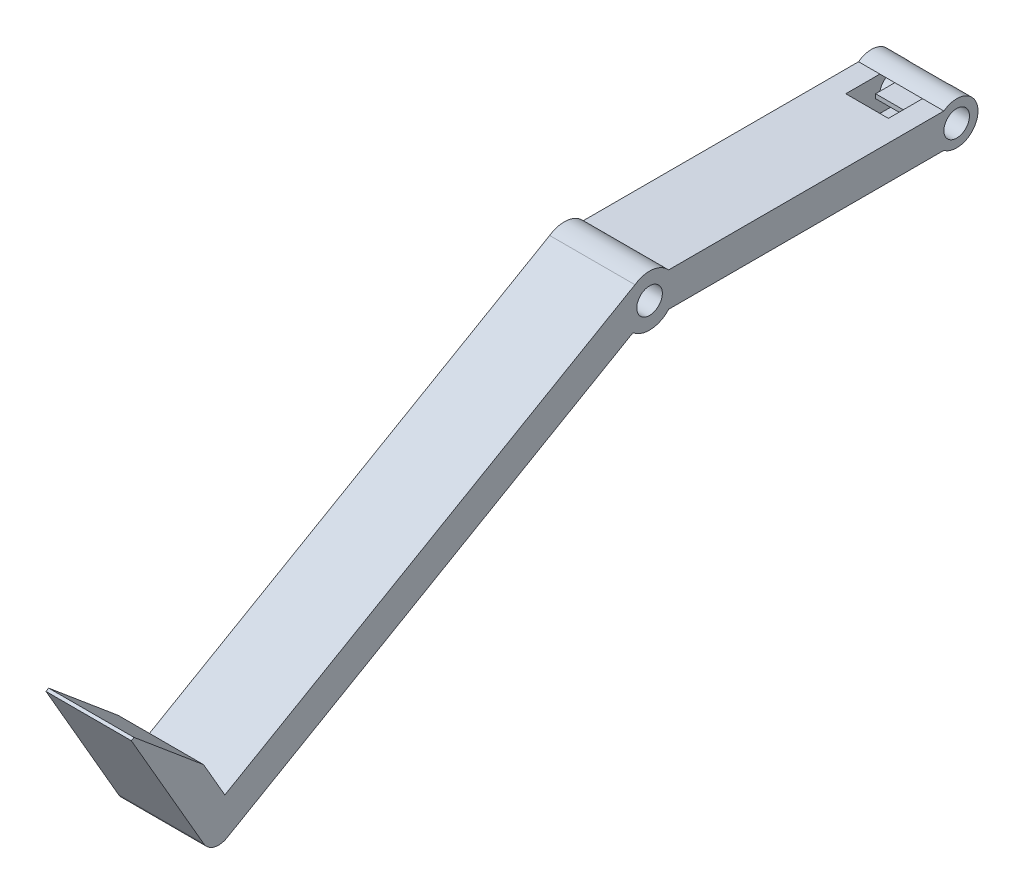
ISO-10303-21;
HEADER;
FILE_DESCRIPTION(('STEP AP214'),'2;1');
FILE_NAME('part.step','',(''),(''),'','','');
FILE_SCHEMA(('AUTOMOTIVE_DESIGN { 1 0 10303 214 1 1 1 1 }'));
ENDSEC;
DATA;
#1=APPLICATION_CONTEXT('core data for automotive mechanical design processes');
#2=APPLICATION_PROTOCOL_DEFINITION('international standard','automotive_design',2000,#1);
#3=PRODUCT_CONTEXT('',#1,'mechanical');
#4=PRODUCT('Part','Part','',(#3));
#5=PRODUCT_RELATED_PRODUCT_CATEGORY('part','',(#4));
#6=PRODUCT_DEFINITION_FORMATION('','',#4);
#7=PRODUCT_DEFINITION_CONTEXT('part definition',#1,'design');
#8=PRODUCT_DEFINITION('design','',#6,#7);
#9=PRODUCT_DEFINITION_SHAPE('','',#8);
#10=(LENGTH_UNIT() NAMED_UNIT(*) SI_UNIT(.MILLI.,.METRE.));
#11=(NAMED_UNIT(*) PLANE_ANGLE_UNIT() SI_UNIT($,.RADIAN.));
#12=(NAMED_UNIT(*) SI_UNIT($,.STERADIAN.) SOLID_ANGLE_UNIT());
#13=UNCERTAINTY_MEASURE_WITH_UNIT(LENGTH_MEASURE(1.E-05),#10,'distance_accuracy_value','');
#14=(GEOMETRIC_REPRESENTATION_CONTEXT(3) GLOBAL_UNCERTAINTY_ASSIGNED_CONTEXT((#13)) GLOBAL_UNIT_ASSIGNED_CONTEXT((#10,
#11,#12)) REPRESENTATION_CONTEXT('',''));
#15=CARTESIAN_POINT('',(0.,0.,0.));
#16=DIRECTION('',(0.,0.,1.));
#17=DIRECTION('',(1.,0.,0.));
#18=AXIS2_PLACEMENT_3D('',#15,#16,#17);
#19=CARTESIAN_POINT('',(-5.,4.71181738099879,19.2829834340757));
#20=DIRECTION('',(0.,0.866025403784442,0.499999999999995));
#21=DIRECTION('',(0.,-0.499999999999995,0.866025403784442));
#22=AXIS2_PLACEMENT_3D('',#19,#20,#21);
#23=PLANE('',#22);
#24=DIRECTION('',(0.,-0.499999999999995,0.866025403784442));
#25=VECTOR('',#24,1.);
#26=CARTESIAN_POINT('',(-5.,4.71181738099879,19.2829834340757));
#27=LINE('',#26,#25);
#28=CARTESIAN_POINT('',(-5.,4.4670049370436,19.7070110253312));
#29=VERTEX_POINT('',#28);
#30=CARTESIAN_POINT('',(-4.99999999999999,-23.2881826190009,67.7804060460045));
#31=VERTEX_POINT('',#30);
#32=EDGE_CURVE('E226',#29,#31,#27,.T.);
#33=ORIENTED_EDGE('',*,*,#32,.T.);
#34=DIRECTION('',(-1.,0.,0.));
#35=VECTOR('',#34,1.);
#36=CARTESIAN_POINT('',(5.00000000000001,-23.2881826190009,67.7804060460045));
#37=LINE('',#36,#35);
#38=CARTESIAN_POINT('',(5.00000000000001,-23.2881826190009,67.7804060460045));
#39=VERTEX_POINT('',#38);
#40=EDGE_CURVE('E237',#39,#31,#37,.T.);
#41=ORIENTED_EDGE('',*,*,#40,.F.);
#42=DIRECTION('',(0.,-0.499999999999995,0.866025403784442));
#43=VECTOR('',#42,1.);
#44=CARTESIAN_POINT('',(5.,4.71181738099879,19.2829834340757));
#45=LINE('',#44,#43);
#46=CARTESIAN_POINT('',(5.,4.4670049370436,19.7070110253312));
#47=VERTEX_POINT('',#46);
#48=EDGE_CURVE('E245',#47,#39,#45,.T.);
#49=ORIENTED_EDGE('',*,*,#48,.F.);
#50=DIRECTION('',(1.,0.,0.));
#51=VECTOR('',#50,1.);
#52=CARTESIAN_POINT('',(-5.,4.46700493704361,19.7070110253312));
#53=LINE('',#52,#51);
#54=EDGE_CURVE('E386',#47,#29,#53,.F.);
#55=ORIENTED_EDGE('',*,*,#54,.T.);
#56=EDGE_LOOP('',(#33,#41,#49,#55));
#57=FACE_BOUND('',#56,.T.);
#58=ADVANCED_FACE('F33',(#57),#23,.T.);
#59=CARTESIAN_POINT('',(-5.,2.,18.));
#60=DIRECTION('',(1.,0.,0.));
#61=DIRECTION('',(0.,0.,-1.));
#62=AXIS2_PLACEMENT_3D('',#59,#60,#61);
#63=CYLINDRICAL_SURFACE('',#62,2.99999999999999);
#64=DIRECTION('',(1.,0.,0.));
#65=VECTOR('',#64,1.);
#66=CARTESIAN_POINT('',(-5.,-0.287125304876964,19.9414061501374));
#67=LINE('',#66,#65);
#68=CARTESIAN_POINT('',(-5.,-0.287125304876964,19.9414061501374));
#69=VERTEX_POINT('',#68);
#70=CARTESIAN_POINT('',(5.,-0.287125304876965,19.9414061501374));
#71=VERTEX_POINT('',#70);
#72=EDGE_CURVE('E391',#69,#71,#67,.T.);
#73=ORIENTED_EDGE('',*,*,#72,.F.);
#74=CARTESIAN_POINT('',(-5.,2.,18.));
#75=DIRECTION('',(1.,0.,0.));
#76=DIRECTION('',(0.,0.,-1.));
#77=AXIS2_PLACEMENT_3D('',#74,#75,#76);
#78=CIRCLE('',#77,2.99999999999999);
#79=CARTESIAN_POINT('',(-5.,0.,15.7639320225002));
#80=VERTEX_POINT('',#79);
#81=EDGE_CURVE('E347',#69,#80,#78,.T.);
#82=ORIENTED_EDGE('',*,*,#81,.T.);
#83=DIRECTION('',(1.,0.,0.));
#84=VECTOR('',#83,1.);
#85=CARTESIAN_POINT('',(-5.,0.,15.7639320225002));
#86=LINE('',#85,#84);
#87=CARTESIAN_POINT('',(5.,0.,15.7639320225002));
#88=VERTEX_POINT('',#87);
#89=EDGE_CURVE('E359',#88,#80,#86,.F.);
#90=ORIENTED_EDGE('',*,*,#89,.F.);
#91=CARTESIAN_POINT('',(5.,2.,18.));
#92=DIRECTION('',(1.,0.,0.));
#93=DIRECTION('',(0.,0.,-1.));
#94=AXIS2_PLACEMENT_3D('',#91,#92,#93);
#95=CIRCLE('',#94,2.99999999999999);
#96=EDGE_CURVE('E342',#71,#88,#95,.T.);
#97=ORIENTED_EDGE('',*,*,#96,.F.);
#98=EDGE_LOOP('',(#73,#82,#90,#97));
#99=FACE_BOUND('',#98,.T.);
#100=ADVANCED_FACE('F420',(#99),#63,.T.);
#101=CARTESIAN_POINT('',(2.5,0.,-12.5));
#102=DIRECTION('',(1.,0.,0.));
#103=DIRECTION('',(0.,0.,-1.));
#104=AXIS2_PLACEMENT_3D('',#101,#102,#103);
#105=PLANE('',#104);
#106=CARTESIAN_POINT('',(2.5,2.,-18.));
#107=DIRECTION('',(1.,0.,0.));
#108=DIRECTION('',(0.,0.,-1.));
#109=AXIS2_PLACEMENT_3D('',#106,#107,#108);
#110=CIRCLE('',#109,2.5);
#111=CARTESIAN_POINT('',(2.5,4.,-19.5));
#112=VERTEX_POINT('',#111);
#113=CARTESIAN_POINT('',(2.5,0.,-19.5));
#114=VERTEX_POINT('',#113);
#115=EDGE_CURVE('E324',#112,#114,#110,.F.);
#116=ORIENTED_EDGE('',*,*,#115,.T.);
#117=DIRECTION('',(0.,0.,-1.));
#118=VECTOR('',#117,1.);
#119=CARTESIAN_POINT('',(2.5,0.,-12.5));
#120=LINE('',#119,#118);
#121=CARTESIAN_POINT('',(2.5,0.,-16.5));
#122=VERTEX_POINT('',#121);
#123=EDGE_CURVE('E299',#122,#114,#120,.T.);
#124=ORIENTED_EDGE('',*,*,#123,.F.);
#125=CARTESIAN_POINT('',(2.5,0.,-12.5));
#126=VERTEX_POINT('',#125);
#127=EDGE_CURVE('E295',#126,#122,#120,.T.);
#128=ORIENTED_EDGE('',*,*,#127,.F.);
#129=DIRECTION('',(0.,1.,0.));
#130=VECTOR('',#129,1.);
#131=CARTESIAN_POINT('',(2.5,0.,-12.5));
#132=LINE('',#131,#130);
#133=CARTESIAN_POINT('',(2.5,4.,-12.5));
#134=VERTEX_POINT('',#133);
#135=EDGE_CURVE('E315',#126,#134,#132,.T.);
#136=ORIENTED_EDGE('',*,*,#135,.T.);
#137=DIRECTION('',(0.,0.,-1.));
#138=VECTOR('',#137,1.);
#139=CARTESIAN_POINT('',(2.5,4.,-12.5));
#140=LINE('',#139,#138);
#141=CARTESIAN_POINT('',(2.5,4.,-16.5));
#142=VERTEX_POINT('',#141);
#143=EDGE_CURVE('E307',#134,#142,#140,.T.);
#144=ORIENTED_EDGE('',*,*,#143,.T.);
#145=EDGE_CURVE('E294',#142,#112,#140,.T.);
#146=ORIENTED_EDGE('',*,*,#145,.T.);
#147=EDGE_LOOP('',(#116,#124,#128,#136,#144,#146));
#148=FACE_BOUND('',#147,.T.);
#149=DIRECTION('',(0.,0.,1.));
#150=VECTOR('',#149,1.);
#151=CARTESIAN_POINT('',(2.5,1.75,-16.));
#152=LINE('',#151,#150);
#153=CARTESIAN_POINT('',(2.5,1.75,-16.5209800542251));
#154=VERTEX_POINT('',#153);
#155=CARTESIAN_POINT('',(2.5,1.75,-16.));
#156=VERTEX_POINT('',#155);
#157=EDGE_CURVE('E271',#154,#156,#152,.T.);
#158=ORIENTED_EDGE('',*,*,#157,.F.);
#159=CARTESIAN_POINT('',(2.5,2.,-18.));
#160=DIRECTION('',(1.,0.,0.));
#161=DIRECTION('',(0.,0.,-1.));
#162=AXIS2_PLACEMENT_3D('',#159,#160,#161);
#163=CIRCLE('',#162,1.5);
#164=CARTESIAN_POINT('',(2.5,1.75,-19.4790199457749));
#165=VERTEX_POINT('',#164);
#166=EDGE_CURVE('E327',#165,#154,#163,.F.);
#167=ORIENTED_EDGE('',*,*,#166,.F.);
#168=CARTESIAN_POINT('',(2.5,1.75,-20.));
#169=VERTEX_POINT('',#168);
#170=EDGE_CURVE('E272',#169,#165,#152,.T.);
#171=ORIENTED_EDGE('',*,*,#170,.F.);
#172=DIRECTION('',(0.,-1.,0.));
#173=VECTOR('',#172,1.);
#174=CARTESIAN_POINT('',(2.5,2.25,-20.));
#175=LINE('',#174,#173);
#176=CARTESIAN_POINT('',(2.5,2.25,-20.));
#177=VERTEX_POINT('',#176);
#178=EDGE_CURVE('E252',#177,#169,#175,.T.);
#179=ORIENTED_EDGE('',*,*,#178,.F.);
#180=DIRECTION('',(0.,0.,-1.));
#181=VECTOR('',#180,1.);
#182=CARTESIAN_POINT('',(2.5,2.25,-16.));
#183=LINE('',#182,#181);
#184=CARTESIAN_POINT('',(2.5,2.25,-19.4790199457749));
#185=VERTEX_POINT('',#184);
#186=EDGE_CURVE('E279',#185,#177,#183,.T.);
#187=ORIENTED_EDGE('',*,*,#186,.F.);
#188=CARTESIAN_POINT('',(2.5,2.25,-16.5209800542251));
#189=VERTEX_POINT('',#188);
#190=EDGE_CURVE('E775',#189,#185,#163,.F.);
#191=ORIENTED_EDGE('',*,*,#190,.F.);
#192=CARTESIAN_POINT('',(2.5,2.25,-16.));
#193=VERTEX_POINT('',#192);
#194=EDGE_CURVE('E260',#193,#189,#183,.T.);
#195=ORIENTED_EDGE('',*,*,#194,.F.);
#196=DIRECTION('',(0.,1.,0.));
#197=VECTOR('',#196,1.);
#198=CARTESIAN_POINT('',(2.5,2.25,-16.));
#199=LINE('',#198,#197);
#200=EDGE_CURVE('E275',#156,#193,#199,.T.);
#201=ORIENTED_EDGE('',*,*,#200,.F.);
#202=EDGE_LOOP('',(#158,#167,#171,#179,#187,#191,#195,#201));
#203=FACE_BOUND('',#202,.T.);
#204=ADVANCED_FACE('F426',(#148,#203),#105,.F.);
#205=CARTESIAN_POINT('',(-2.5,0.,-12.5));
#206=DIRECTION('',(-1.,0.,0.));
#207=DIRECTION('',(0.,0.,1.));
#208=AXIS2_PLACEMENT_3D('',#205,#206,#207);
#209=PLANE('',#208);
#210=CARTESIAN_POINT('',(-2.5,2.,-18.));
#211=DIRECTION('',(-1.,0.,0.));
#212=DIRECTION('',(0.,0.,1.));
#213=AXIS2_PLACEMENT_3D('',#210,#211,#212);
#214=CIRCLE('',#213,2.5);
#215=CARTESIAN_POINT('',(-2.5,0.,-19.5));
#216=VERTEX_POINT('',#215);
#217=CARTESIAN_POINT('',(-2.5,4.,-19.5));
#218=VERTEX_POINT('',#217);
#219=EDGE_CURVE('E320',#216,#218,#214,.F.);
#220=ORIENTED_EDGE('',*,*,#219,.T.);
#221=DIRECTION('',(0.,0.,1.));
#222=VECTOR('',#221,1.);
#223=CARTESIAN_POINT('',(-2.5,4.,-12.5));
#224=LINE('',#223,#222);
#225=CARTESIAN_POINT('',(-2.5,4.,-16.5));
#226=VERTEX_POINT('',#225);
#227=EDGE_CURVE('E311',#218,#226,#224,.T.);
#228=ORIENTED_EDGE('',*,*,#227,.T.);
#229=CARTESIAN_POINT('',(-2.5,4.,-12.5));
#230=VERTEX_POINT('',#229);
#231=EDGE_CURVE('E309',#226,#230,#224,.T.);
#232=ORIENTED_EDGE('',*,*,#231,.T.);
#233=DIRECTION('',(0.,1.,0.));
#234=VECTOR('',#233,1.);
#235=CARTESIAN_POINT('',(-2.5,0.,-12.5));
#236=LINE('',#235,#234);
#237=CARTESIAN_POINT('',(-2.5,0.,-12.5));
#238=VERTEX_POINT('',#237);
#239=EDGE_CURVE('E306',#238,#230,#236,.T.);
#240=ORIENTED_EDGE('',*,*,#239,.F.);
#241=DIRECTION('',(0.,0.,1.));
#242=VECTOR('',#241,1.);
#243=CARTESIAN_POINT('',(-2.5,0.,-12.5));
#244=LINE('',#243,#242);
#245=CARTESIAN_POINT('',(-2.5,0.,-16.5));
#246=VERTEX_POINT('',#245);
#247=EDGE_CURVE('E298',#246,#238,#244,.T.);
#248=ORIENTED_EDGE('',*,*,#247,.F.);
#249=EDGE_CURVE('E302',#216,#246,#244,.T.);
#250=ORIENTED_EDGE('',*,*,#249,.F.);
#251=EDGE_LOOP('',(#220,#228,#232,#240,#248,#250));
#252=FACE_BOUND('',#251,.T.);
#253=DIRECTION('',(0.,0.,1.));
#254=VECTOR('',#253,1.);
#255=CARTESIAN_POINT('',(-2.5,1.75,-16.));
#256=LINE('',#255,#254);
#257=CARTESIAN_POINT('',(-2.5,1.75,-20.));
#258=VERTEX_POINT('',#257);
#259=CARTESIAN_POINT('',(-2.5,1.75,-19.4790199457749));
#260=VERTEX_POINT('',#259);
#261=EDGE_CURVE('E261',#258,#260,#256,.T.);
#262=ORIENTED_EDGE('',*,*,#261,.T.);
#263=CARTESIAN_POINT('',(-2.5,2.,-18.));
#264=DIRECTION('',(-1.,0.,0.));
#265=DIRECTION('',(0.,0.,1.));
#266=AXIS2_PLACEMENT_3D('',#263,#264,#265);
#267=CIRCLE('',#266,1.5);
#268=CARTESIAN_POINT('',(-2.5,1.75,-16.5209800542251));
#269=VERTEX_POINT('',#268);
#270=EDGE_CURVE('E323',#269,#260,#267,.F.);
#271=ORIENTED_EDGE('',*,*,#270,.F.);
#272=DIRECTION('',(0.,0.,-1.));
#273=VECTOR('',#272,1.);
#274=CARTESIAN_POINT('',(-2.5,1.75,-12.5));
#275=LINE('',#274,#273);
#276=CARTESIAN_POINT('',(-2.5,1.75,-16.));
#277=VERTEX_POINT('',#276);
#278=EDGE_CURVE('E382',#277,#269,#275,.T.);
#279=ORIENTED_EDGE('',*,*,#278,.F.);
#280=DIRECTION('',(0.,1.,0.));
#281=VECTOR('',#280,1.);
#282=CARTESIAN_POINT('',(-2.5,2.25,-16.));
#283=LINE('',#282,#281);
#284=CARTESIAN_POINT('',(-2.5,2.25,-16.));
#285=VERTEX_POINT('',#284);
#286=EDGE_CURVE('E263',#277,#285,#283,.T.);
#287=ORIENTED_EDGE('',*,*,#286,.T.);
#288=DIRECTION('',(0.,0.,-1.));
#289=VECTOR('',#288,1.);
#290=CARTESIAN_POINT('',(-2.5,2.25,-16.));
#291=LINE('',#290,#289);
#292=CARTESIAN_POINT('',(-2.5,2.25,-16.5209800542251));
#293=VERTEX_POINT('',#292);
#294=EDGE_CURVE('E266',#285,#293,#291,.T.);
#295=ORIENTED_EDGE('',*,*,#294,.T.);
#296=CARTESIAN_POINT('',(-2.5,2.25,-19.4790199457749));
#297=VERTEX_POINT('',#296);
#298=EDGE_CURVE('E758',#297,#293,#267,.F.);
#299=ORIENTED_EDGE('',*,*,#298,.F.);
#300=DIRECTION('',(0.,0.,1.));
#301=VECTOR('',#300,1.);
#302=CARTESIAN_POINT('',(-2.5,2.25,-12.5));
#303=LINE('',#302,#301);
#304=CARTESIAN_POINT('',(-2.5,2.25,-20.));
#305=VERTEX_POINT('',#304);
#306=EDGE_CURVE('E383',#305,#297,#303,.T.);
#307=ORIENTED_EDGE('',*,*,#306,.F.);
#308=DIRECTION('',(0.,-1.,0.));
#309=VECTOR('',#308,1.);
#310=CARTESIAN_POINT('',(-2.5,2.25,-20.));
#311=LINE('',#310,#309);
#312=EDGE_CURVE('E257',#305,#258,#311,.T.);
#313=ORIENTED_EDGE('',*,*,#312,.T.);
#314=EDGE_LOOP('',(#262,#271,#279,#287,#295,#299,#307,#313));
#315=FACE_BOUND('',#314,.T.);
#316=ADVANCED_FACE('F470',(#252,#315),#209,.F.);
#317=CARTESIAN_POINT('',(-5.,2.,-18.));
#318=DIRECTION('',(1.,0.,0.));
#319=DIRECTION('',(0.,0.,-1.));
#320=AXIS2_PLACEMENT_3D('',#317,#318,#319);
#321=CYLINDRICAL_SURFACE('',#320,1.5);
#322=ORIENTED_EDGE('',*,*,#166,.T.);
#323=EDGE_CURVE('E377',#154,#189,#163,.F.);
#324=ORIENTED_EDGE('',*,*,#323,.T.);
#325=ORIENTED_EDGE('',*,*,#190,.T.);
#326=EDGE_CURVE('E322',#185,#165,#163,.F.);
#327=ORIENTED_EDGE('',*,*,#326,.T.);
#328=EDGE_LOOP('',(#322,#324,#325,#327));
#329=FACE_BOUND('',#328,.T.);
#330=CARTESIAN_POINT('',(5.,2.,-18.));
#331=DIRECTION('',(1.,0.,0.));
#332=DIRECTION('',(0.,0.,-1.));
#333=AXIS2_PLACEMENT_3D('',#330,#331,#332);
#334=CIRCLE('',#333,1.5);
#335=CARTESIAN_POINT('',(5.,2.,-19.5));
#336=VERTEX_POINT('',#335);
#337=EDGE_CURVE('E326',#336,#336,#334,.T.);
#338=ORIENTED_EDGE('',*,*,#337,.T.);
#339=EDGE_LOOP('',(#338));
#340=FACE_BOUND('',#339,.T.);
#341=ADVANCED_FACE('F473',(#329,#340),#321,.F.);
#342=CARTESIAN_POINT('',(5.,4.,-18.));
#343=DIRECTION('',(-1.,0.,0.));
#344=DIRECTION('',(0.,0.,1.));
#345=AXIS2_PLACEMENT_3D('',#342,#343,#344);
#346=PLANE('',#345);
#347=CARTESIAN_POINT('',(5.,2.,18.));
#348=DIRECTION('',(1.,0.,0.));
#349=DIRECTION('',(0.,0.,-1.));
#350=AXIS2_PLACEMENT_3D('',#347,#348,#349);
#351=CIRCLE('',#350,1.5);
#352=CARTESIAN_POINT('',(5.,2.,16.5));
#353=VERTEX_POINT('',#352);
#354=EDGE_CURVE('E241',#353,#353,#351,.T.);
#355=ORIENTED_EDGE('',*,*,#354,.F.);
#356=EDGE_LOOP('',(#355));
#357=FACE_BOUND('',#356,.T.);
#358=DIRECTION('',(0.,-0.866025403784441,-0.499999999999995));
#359=VECTOR('',#358,1.);
#360=CARTESIAN_POINT('',(5.00000000000001,-10.2978015622343,75.2804060460044));
#361=LINE('',#360,#359);
#362=CARTESIAN_POINT('',(5.00000000000001,-18.9580556000788,70.2804060460044));
#363=VERTEX_POINT('',#362);
#364=EDGE_CURVE('E233',#363,#39,#361,.T.);
#365=ORIENTED_EDGE('',*,*,#364,.F.);
#366=DIRECTION('',(0.,0.642787609686544,0.766044443118974));
#367=VECTOR('',#366,1.);
#368=CARTESIAN_POINT('',(5.00000000000001,-12.1176527335653,78.4324807369635));
#369=LINE('',#368,#367);
#370=CARTESIAN_POINT('',(5.00000000000001,-12.1176527335653,78.4324807369635));
#371=VERTEX_POINT('',#370);
#372=EDGE_CURVE('E11',#363,#371,#369,.T.);
#373=ORIENTED_EDGE('',*,*,#372,.T.);
#374=DIRECTION('',(0.,0.499999999999995,-0.866025403784442));
#375=VECTOR('',#374,1.);
#376=CARTESIAN_POINT('',(5.00000000000001,-12.2978015622343,78.7445076611422));
#377=LINE('',#376,#375);
#378=CARTESIAN_POINT('',(5.00000000000001,-12.2978015622343,78.7445076611422));
#379=VERTEX_POINT('',#378);
#380=EDGE_CURVE('E213',#379,#371,#377,.T.);
#381=ORIENTED_EDGE('',*,*,#380,.F.);
#382=DIRECTION('',(0.,-0.866025403784438,-0.5));
#383=VECTOR('',#382,1.);
#384=CARTESIAN_POINT('',(5.00000000000001,-25.2881826190009,71.2445076611422));
#385=LINE('',#384,#383);
#386=CARTESIAN_POINT('',(5.00000000000001,-27.0202334265698,70.2445076611422));
#387=VERTEX_POINT('',#386);
#388=EDGE_CURVE('E230',#379,#387,#385,.T.);
#389=ORIENTED_EDGE('',*,*,#388,.T.);
#390=CARTESIAN_POINT('',(5.00000000000001,-26.0202334265698,68.5124568535734));
#391=DIRECTION('',(-1.,0.,0.));
#392=DIRECTION('',(0.,0.,1.));
#393=AXIS2_PLACEMENT_3D('',#390,#391,#392);
#394=CIRCLE('',#393,2.);
#395=CARTESIAN_POINT('',(5.00000000000001,-27.7522842341387,67.5124568535734));
#396=VERTEX_POINT('',#395);
#397=EDGE_CURVE('E396',#387,#396,#394,.F.);
#398=ORIENTED_EDGE('',*,*,#397,.T.);
#399=DIRECTION('',(0.,0.499999999999995,-0.866025403784441));
#400=VECTOR('',#399,1.);
#401=CARTESIAN_POINT('',(5.,1.24771576586103,17.2829834340758));
#402=LINE('',#401,#400);
#403=EDGE_CURVE('E249',#396,#71,#402,.T.);
#404=ORIENTED_EDGE('',*,*,#403,.T.);
#405=ORIENTED_EDGE('',*,*,#96,.T.);
#406=DIRECTION('',(0.,0.,-1.));
#407=VECTOR('',#406,1.);
#408=CARTESIAN_POINT('',(5.,0.,-18.));
#409=LINE('',#408,#407);
#410=CARTESIAN_POINT('',(5.,0.,-16.5));
#411=VERTEX_POINT('',#410);
#412=EDGE_CURVE('E352',#88,#411,#409,.T.);
#413=ORIENTED_EDGE('',*,*,#412,.T.);
#414=CARTESIAN_POINT('',(5.,2.,-18.));
#415=DIRECTION('',(1.,0.,0.));
#416=DIRECTION('',(0.,0.,-1.));
#417=AXIS2_PLACEMENT_3D('',#414,#415,#416);
#418=CIRCLE('',#417,2.5);
#419=CARTESIAN_POINT('',(5.,4.,-16.5));
#420=VERTEX_POINT('',#419);
#421=EDGE_CURVE('E331',#411,#420,#418,.T.);
#422=ORIENTED_EDGE('',*,*,#421,.T.);
#423=DIRECTION('',(0.,0.,-1.));
#424=VECTOR('',#423,1.);
#425=CARTESIAN_POINT('',(5.,4.,-18.));
#426=LINE('',#425,#424);
#427=CARTESIAN_POINT('',(5.,4.,15.7639320225002));
#428=VERTEX_POINT('',#427);
#429=EDGE_CURVE('E353',#428,#420,#426,.T.);
#430=ORIENTED_EDGE('',*,*,#429,.F.);
#431=EDGE_CURVE('E348',#428,#47,#95,.T.);
#432=ORIENTED_EDGE('',*,*,#431,.T.);
#433=ORIENTED_EDGE('',*,*,#48,.T.);
#434=EDGE_LOOP('',(#365,#373,#381,#389,#398,#404,#405,#413,#422,#430,#432,#433));
#435=FACE_BOUND('',#434,.T.);
#436=ORIENTED_EDGE('',*,*,#337,.F.);
#437=EDGE_LOOP('',(#436));
#438=FACE_BOUND('',#437,.T.);
#439=ADVANCED_FACE('F411',(#357,#435,#438),#346,.F.);
#440=CARTESIAN_POINT('',(-5.,4.,-18.));
#441=DIRECTION('',(1.,0.,0.));
#442=DIRECTION('',(0.,0.,-1.));
#443=AXIS2_PLACEMENT_3D('',#440,#441,#442);
#444=PLANE('',#443);
#445=CARTESIAN_POINT('',(-5.,2.,18.));
#446=DIRECTION('',(1.,0.,0.));
#447=DIRECTION('',(0.,0.,-1.));
#448=AXIS2_PLACEMENT_3D('',#445,#446,#447);
#449=CIRCLE('',#448,1.5);
#450=CARTESIAN_POINT('',(-5.,2.,16.5));
#451=VERTEX_POINT('',#450);
#452=EDGE_CURVE('E242',#451,#451,#449,.T.);
#453=ORIENTED_EDGE('',*,*,#452,.T.);
#454=EDGE_LOOP('',(#453));
#455=FACE_BOUND('',#454,.T.);
#456=DIRECTION('',(0.,-0.499999999999995,0.866025403784442));
#457=VECTOR('',#456,1.);
#458=CARTESIAN_POINT('',(-4.99999999999999,-12.2978015622343,78.7445076611422));
#459=LINE('',#458,#457);
#460=CARTESIAN_POINT('',(-4.99999999999999,-12.1176527335653,78.4324807369635));
#461=VERTEX_POINT('',#460);
#462=CARTESIAN_POINT('',(-4.99999999999999,-12.2978015622343,78.7445076611422));
#463=VERTEX_POINT('',#462);
#464=EDGE_CURVE('E204',#461,#463,#459,.T.);
#465=ORIENTED_EDGE('',*,*,#464,.F.);
#466=DIRECTION('',(0.,-0.642787609686544,-0.766044443118974));
#467=VECTOR('',#466,1.);
#468=CARTESIAN_POINT('',(-4.99999999999999,-12.1176527335653,78.4324807369635));
#469=LINE('',#468,#467);
#470=CARTESIAN_POINT('',(-4.99999999999999,-18.9580556000788,70.2804060460044));
#471=VERTEX_POINT('',#470);
#472=EDGE_CURVE('E55',#461,#471,#469,.T.);
#473=ORIENTED_EDGE('',*,*,#472,.T.);
#474=DIRECTION('',(0.,-0.866025403784441,-0.499999999999995));
#475=VECTOR('',#474,1.);
#476=CARTESIAN_POINT('',(-4.99999999999999,-10.2978015622343,75.2804060460044));
#477=LINE('',#476,#475);
#478=EDGE_CURVE('E231',#471,#31,#477,.T.);
#479=ORIENTED_EDGE('',*,*,#478,.T.);
#480=ORIENTED_EDGE('',*,*,#32,.F.);
#481=CARTESIAN_POINT('',(-5.,4.,15.7639320225002));
#482=VERTEX_POINT('',#481);
#483=EDGE_CURVE('E344',#482,#29,#78,.T.);
#484=ORIENTED_EDGE('',*,*,#483,.F.);
#485=DIRECTION('',(0.,0.,1.));
#486=VECTOR('',#485,1.);
#487=CARTESIAN_POINT('',(-5.,4.,-18.));
#488=LINE('',#487,#486);
#489=CARTESIAN_POINT('',(-5.,4.,-16.5));
#490=VERTEX_POINT('',#489);
#491=EDGE_CURVE('E356',#490,#482,#488,.T.);
#492=ORIENTED_EDGE('',*,*,#491,.F.);
#493=CARTESIAN_POINT('',(-5.,2.,-18.));
#494=DIRECTION('',(1.,0.,0.));
#495=DIRECTION('',(0.,0.,-1.));
#496=AXIS2_PLACEMENT_3D('',#493,#494,#495);
#497=CIRCLE('',#496,2.5);
#498=CARTESIAN_POINT('',(-5.,0.,-16.5));
#499=VERTEX_POINT('',#498);
#500=EDGE_CURVE('E334',#499,#490,#497,.T.);
#501=ORIENTED_EDGE('',*,*,#500,.F.);
#502=DIRECTION('',(0.,0.,1.));
#503=VECTOR('',#502,1.);
#504=CARTESIAN_POINT('',(-5.,0.,-18.));
#505=LINE('',#504,#503);
#506=EDGE_CURVE('E357',#499,#80,#505,.T.);
#507=ORIENTED_EDGE('',*,*,#506,.T.);
#508=ORIENTED_EDGE('',*,*,#81,.F.);
#509=DIRECTION('',(0.,0.499999999999995,-0.866025403784441));
#510=VECTOR('',#509,1.);
#511=CARTESIAN_POINT('',(-5.,1.24771576586103,17.2829834340758));
#512=LINE('',#511,#510);
#513=CARTESIAN_POINT('',(-4.99999999999999,-27.7522842341387,67.5124568535734));
#514=VERTEX_POINT('',#513);
#515=EDGE_CURVE('E225',#514,#69,#512,.T.);
#516=ORIENTED_EDGE('',*,*,#515,.F.);
#517=CARTESIAN_POINT('',(-4.99999999999999,-26.0202334265698,68.5124568535734));
#518=DIRECTION('',(1.,0.,0.));
#519=DIRECTION('',(0.,0.,-1.));
#520=AXIS2_PLACEMENT_3D('',#517,#518,#519);
#521=CIRCLE('',#520,2.);
#522=CARTESIAN_POINT('',(-4.99999999999999,-27.0202334265698,70.2445076611422));
#523=VERTEX_POINT('',#522);
#524=EDGE_CURVE('E221',#514,#523,#521,.F.);
#525=ORIENTED_EDGE('',*,*,#524,.T.);
#526=DIRECTION('',(0.,-0.866025403784438,-0.5));
#527=VECTOR('',#526,1.);
#528=CARTESIAN_POINT('',(-4.99999999999999,-25.2881826190009,71.2445076611422));
#529=LINE('',#528,#527);
#530=EDGE_CURVE('E216',#463,#523,#529,.T.);
#531=ORIENTED_EDGE('',*,*,#530,.F.);
#532=EDGE_LOOP('',(#465,#473,#479,#480,#484,#492,#501,#507,#508,#516,#525,#531));
#533=FACE_BOUND('',#532,.T.);
#534=CARTESIAN_POINT('',(-5.,2.,-18.));
#535=DIRECTION('',(1.,0.,0.));
#536=DIRECTION('',(0.,0.,-1.));
#537=AXIS2_PLACEMENT_3D('',#534,#535,#536);
#538=CIRCLE('',#537,1.5);
#539=CARTESIAN_POINT('',(-5.,2.,-19.5));
#540=VERTEX_POINT('',#539);
#541=EDGE_CURVE('E328',#540,#540,#538,.T.);
#542=ORIENTED_EDGE('',*,*,#541,.T.);
#543=EDGE_LOOP('',(#542));
#544=FACE_BOUND('',#543,.T.);
#545=ADVANCED_FACE('F217',(#455,#533,#544),#444,.F.);
#546=CARTESIAN_POINT('',(0.,4.,0.));
#547=DIRECTION('',(0.,1.,0.));
#548=DIRECTION('',(0.,0.,1.));
#549=AXIS2_PLACEMENT_3D('',#546,#547,#548);
#550=PLANE('',#549);
#551=ORIENTED_EDGE('',*,*,#143,.F.);
#552=DIRECTION('',(1.,0.,0.));
#553=VECTOR('',#552,1.);
#554=CARTESIAN_POINT('',(-2.5,4.,-12.5));
#555=LINE('',#554,#553);
#556=EDGE_CURVE('E312',#230,#134,#555,.T.);
#557=ORIENTED_EDGE('',*,*,#556,.F.);
#558=ORIENTED_EDGE('',*,*,#231,.F.);
#559=DIRECTION('',(1.,0.,0.));
#560=VECTOR('',#559,1.);
#561=CARTESIAN_POINT('',(-5.,4.,-16.5));
#562=LINE('',#561,#560);
#563=EDGE_CURVE('E339',#490,#226,#562,.T.);
#564=ORIENTED_EDGE('',*,*,#563,.F.);
#565=ORIENTED_EDGE('',*,*,#491,.T.);
#566=DIRECTION('',(1.,0.,0.));
#567=VECTOR('',#566,1.);
#568=CARTESIAN_POINT('',(-5.,4.,15.7639320225002));
#569=LINE('',#568,#567);
#570=EDGE_CURVE('E346',#428,#482,#569,.F.);
#571=ORIENTED_EDGE('',*,*,#570,.F.);
#572=ORIENTED_EDGE('',*,*,#429,.T.);
#573=EDGE_CURVE('E336',#142,#420,#562,.T.);
#574=ORIENTED_EDGE('',*,*,#573,.F.);
#575=EDGE_LOOP('',(#551,#557,#558,#564,#565,#571,#572,#574));
#576=FACE_BOUND('',#575,.T.);
#577=ADVANCED_FACE('F488',(#576),#550,.T.);
#578=CARTESIAN_POINT('',(0.,0.,0.));
#579=DIRECTION('',(0.,1.,0.));
#580=DIRECTION('',(0.,0.,1.));
#581=AXIS2_PLACEMENT_3D('',#578,#579,#580);
#582=PLANE('',#581);
#583=DIRECTION('',(1.,0.,0.));
#584=VECTOR('',#583,1.);
#585=CARTESIAN_POINT('',(-2.5,0.,-12.5));
#586=LINE('',#585,#584);
#587=EDGE_CURVE('E303',#238,#126,#586,.T.);
#588=ORIENTED_EDGE('',*,*,#587,.T.);
#589=ORIENTED_EDGE('',*,*,#127,.T.);
#590=DIRECTION('',(1.,0.,0.));
#591=VECTOR('',#590,1.);
#592=CARTESIAN_POINT('',(-5.,0.,-16.5));
#593=LINE('',#592,#591);
#594=EDGE_CURVE('E366',#122,#411,#593,.T.);
#595=ORIENTED_EDGE('',*,*,#594,.T.);
#596=ORIENTED_EDGE('',*,*,#412,.F.);
#597=ORIENTED_EDGE('',*,*,#89,.T.);
#598=ORIENTED_EDGE('',*,*,#506,.F.);
#599=EDGE_CURVE('E367',#499,#246,#593,.T.);
#600=ORIENTED_EDGE('',*,*,#599,.T.);
#601=ORIENTED_EDGE('',*,*,#247,.T.);
#602=EDGE_LOOP('',(#588,#589,#595,#596,#597,#598,#600,#601));
#603=FACE_BOUND('',#602,.T.);
#604=ADVANCED_FACE('F486',(#603),#582,.F.);
#605=ORIENTED_EDGE('',*,*,#54,.F.);
#606=ORIENTED_EDGE('',*,*,#431,.F.);
#607=ORIENTED_EDGE('',*,*,#570,.T.);
#608=ORIENTED_EDGE('',*,*,#483,.T.);
#609=EDGE_LOOP('',(#605,#606,#607,#608));
#610=FACE_BOUND('',#609,.T.);
#611=ADVANCED_FACE('F429',(#610),#63,.T.);
#612=CARTESIAN_POINT('',(-5.,2.,-18.));
#613=DIRECTION('',(1.,0.,0.));
#614=DIRECTION('',(0.,0.,-1.));
#615=AXIS2_PLACEMENT_3D('',#612,#613,#614);
#616=CYLINDRICAL_SURFACE('',#615,2.5);
#617=DIRECTION('',(1.,0.,0.));
#618=VECTOR('',#617,1.);
#619=CARTESIAN_POINT('',(-5.,0.,-19.5));
#620=LINE('',#619,#618);
#621=EDGE_CURVE('E380',#114,#216,#620,.F.);
#622=ORIENTED_EDGE('',*,*,#621,.F.);
#623=ORIENTED_EDGE('',*,*,#115,.F.);
#624=DIRECTION('',(1.,0.,0.));
#625=VECTOR('',#624,1.);
#626=CARTESIAN_POINT('',(-5.,4.,-19.5));
#627=LINE('',#626,#625);
#628=EDGE_CURVE('E370',#112,#218,#627,.F.);
#629=ORIENTED_EDGE('',*,*,#628,.T.);
#630=ORIENTED_EDGE('',*,*,#219,.F.);
#631=EDGE_LOOP('',(#622,#623,#629,#630));
#632=FACE_BOUND('',#631,.T.);
#633=ORIENTED_EDGE('',*,*,#500,.T.);
#634=ORIENTED_EDGE('',*,*,#563,.T.);
#635=EDGE_CURVE('E343',#226,#142,#562,.T.);
#636=ORIENTED_EDGE('',*,*,#635,.T.);
#637=ORIENTED_EDGE('',*,*,#573,.T.);
#638=ORIENTED_EDGE('',*,*,#421,.F.);
#639=ORIENTED_EDGE('',*,*,#594,.F.);
#640=EDGE_CURVE('E371',#246,#122,#593,.T.);
#641=ORIENTED_EDGE('',*,*,#640,.F.);
#642=ORIENTED_EDGE('',*,*,#599,.F.);
#643=EDGE_LOOP('',(#633,#634,#636,#637,#638,#639,#641,#642));
#644=FACE_BOUND('',#643,.T.);
#645=ADVANCED_FACE('F480',(#632,#644),#616,.T.);
#646=ORIENTED_EDGE('',*,*,#270,.T.);
#647=EDGE_CURVE('E374',#260,#297,#267,.F.);
#648=ORIENTED_EDGE('',*,*,#647,.T.);
#649=ORIENTED_EDGE('',*,*,#298,.T.);
#650=EDGE_CURVE('E317',#293,#269,#267,.F.);
#651=ORIENTED_EDGE('',*,*,#650,.T.);
#652=EDGE_LOOP('',(#646,#648,#649,#651));
#653=FACE_BOUND('',#652,.T.);
#654=ORIENTED_EDGE('',*,*,#541,.F.);
#655=EDGE_LOOP('',(#654));
#656=FACE_BOUND('',#655,.T.);
#657=ADVANCED_FACE('F468',(#653,#656),#321,.F.);
#658=CARTESIAN_POINT('',(-2.5,0.,-12.5));
#659=DIRECTION('',(0.,0.,1.));
#660=DIRECTION('',(1.,0.,0.));
#661=AXIS2_PLACEMENT_3D('',#658,#659,#660);
#662=PLANE('',#661);
#663=ORIENTED_EDGE('',*,*,#556,.T.);
#664=ORIENTED_EDGE('',*,*,#135,.F.);
#665=ORIENTED_EDGE('',*,*,#587,.F.);
#666=ORIENTED_EDGE('',*,*,#239,.T.);
#667=EDGE_LOOP('',(#663,#664,#665,#666));
#668=FACE_BOUND('',#667,.T.);
#669=ADVANCED_FACE('F461',(#668),#662,.F.);
#670=CARTESIAN_POINT('',(0.,0.,0.));
#671=DIRECTION('',(0.,-1.,0.));
#672=DIRECTION('',(0.,0.,-1.));
#673=AXIS2_PLACEMENT_3D('',#670,#671,#672);
#674=PLANE('',#673);
#675=ORIENTED_EDGE('',*,*,#621,.T.);
#676=ORIENTED_EDGE('',*,*,#249,.T.);
#677=ORIENTED_EDGE('',*,*,#640,.T.);
#678=ORIENTED_EDGE('',*,*,#123,.T.);
#679=EDGE_LOOP('',(#675,#676,#677,#678));
#680=FACE_BOUND('',#679,.T.);
#681=ADVANCED_FACE('F458',(#680),#674,.F.);
#682=CARTESIAN_POINT('',(0.,4.,0.));
#683=DIRECTION('',(0.,-1.,0.));
#684=DIRECTION('',(0.,0.,-1.));
#685=AXIS2_PLACEMENT_3D('',#682,#683,#684);
#686=PLANE('',#685);
#687=ORIENTED_EDGE('',*,*,#145,.F.);
#688=ORIENTED_EDGE('',*,*,#635,.F.);
#689=ORIENTED_EDGE('',*,*,#227,.F.);
#690=ORIENTED_EDGE('',*,*,#628,.F.);
#691=EDGE_LOOP('',(#687,#688,#689,#690));
#692=FACE_BOUND('',#691,.T.);
#693=ADVANCED_FACE('F441',(#692),#686,.T.);
#694=CARTESIAN_POINT('',(2.5,0.,0.));
#695=DIRECTION('',(1.,0.,0.));
#696=DIRECTION('',(0.,0.,-1.));
#697=AXIS2_PLACEMENT_3D('',#694,#695,#696);
#698=PLANE('',#697);
#699=ORIENTED_EDGE('',*,*,#323,.F.);
#700=EDGE_CURVE('E276',#165,#154,#152,.T.);
#701=ORIENTED_EDGE('',*,*,#700,.F.);
#702=ORIENTED_EDGE('',*,*,#326,.F.);
#703=EDGE_CURVE('E282',#189,#185,#183,.T.);
#704=ORIENTED_EDGE('',*,*,#703,.F.);
#705=EDGE_LOOP('',(#699,#701,#702,#704));
#706=FACE_BOUND('',#705,.T.);
#707=ADVANCED_FACE('F437',(#706),#698,.T.);
#708=CARTESIAN_POINT('',(-2.5,0.,0.));
#709=DIRECTION('',(1.,0.,0.));
#710=DIRECTION('',(0.,0.,-1.));
#711=AXIS2_PLACEMENT_3D('',#708,#709,#710);
#712=PLANE('',#711);
#713=EDGE_CURVE('E259',#260,#269,#256,.T.);
#714=ORIENTED_EDGE('',*,*,#713,.T.);
#715=ORIENTED_EDGE('',*,*,#650,.F.);
#716=EDGE_CURVE('E265',#293,#297,#291,.T.);
#717=ORIENTED_EDGE('',*,*,#716,.T.);
#718=ORIENTED_EDGE('',*,*,#647,.F.);
#719=EDGE_LOOP('',(#714,#715,#717,#718));
#720=FACE_BOUND('',#719,.T.);
#721=ADVANCED_FACE('F433',(#720),#712,.F.);
#722=CARTESIAN_POINT('',(-2.5,2.25,-20.));
#723=DIRECTION('',(0.,0.,1.));
#724=DIRECTION('',(1.,0.,0.));
#725=AXIS2_PLACEMENT_3D('',#722,#723,#724);
#726=PLANE('',#725);
#727=ORIENTED_EDGE('',*,*,#178,.T.);
#728=DIRECTION('',(1.,0.,0.));
#729=VECTOR('',#728,1.);
#730=CARTESIAN_POINT('',(-2.5,1.75,-20.));
#731=LINE('',#730,#729);
#732=EDGE_CURVE('E291',#258,#169,#731,.T.);
#733=ORIENTED_EDGE('',*,*,#732,.F.);
#734=ORIENTED_EDGE('',*,*,#312,.F.);
#735=DIRECTION('',(1.,0.,0.));
#736=VECTOR('',#735,1.);
#737=CARTESIAN_POINT('',(-2.5,2.25,-20.));
#738=LINE('',#737,#736);
#739=EDGE_CURVE('E268',#305,#177,#738,.T.);
#740=ORIENTED_EDGE('',*,*,#739,.T.);
#741=EDGE_LOOP('',(#727,#733,#734,#740));
#742=FACE_BOUND('',#741,.T.);
#743=ADVANCED_FACE('F436',(#742),#726,.F.);
#744=CARTESIAN_POINT('',(-2.5,1.75,-16.));
#745=DIRECTION('',(0.,1.,0.));
#746=DIRECTION('',(0.,0.,1.));
#747=AXIS2_PLACEMENT_3D('',#744,#745,#746);
#748=PLANE('',#747);
#749=ORIENTED_EDGE('',*,*,#170,.T.);
#750=ORIENTED_EDGE('',*,*,#700,.T.);
#751=ORIENTED_EDGE('',*,*,#157,.T.);
#752=DIRECTION('',(1.,0.,0.));
#753=VECTOR('',#752,1.);
#754=CARTESIAN_POINT('',(-2.5,1.75,-16.));
#755=LINE('',#754,#753);
#756=EDGE_CURVE('E288',#277,#156,#755,.T.);
#757=ORIENTED_EDGE('',*,*,#756,.F.);
#758=ORIENTED_EDGE('',*,*,#278,.T.);
#759=ORIENTED_EDGE('',*,*,#713,.F.);
#760=ORIENTED_EDGE('',*,*,#261,.F.);
#761=ORIENTED_EDGE('',*,*,#732,.T.);
#762=EDGE_LOOP('',(#749,#750,#751,#757,#758,#759,#760,#761));
#763=FACE_BOUND('',#762,.T.);
#764=ADVANCED_FACE('F450',(#763),#748,.F.);
#765=CARTESIAN_POINT('',(-2.5,2.25,-16.));
#766=DIRECTION('',(0.,0.,-1.));
#767=DIRECTION('',(-1.,0.,0.));
#768=AXIS2_PLACEMENT_3D('',#765,#766,#767);
#769=PLANE('',#768);
#770=ORIENTED_EDGE('',*,*,#200,.T.);
#771=DIRECTION('',(1.,0.,0.));
#772=VECTOR('',#771,1.);
#773=CARTESIAN_POINT('',(-2.5,2.25,-16.));
#774=LINE('',#773,#772);
#775=EDGE_CURVE('E285',#285,#193,#774,.T.);
#776=ORIENTED_EDGE('',*,*,#775,.F.);
#777=ORIENTED_EDGE('',*,*,#286,.F.);
#778=ORIENTED_EDGE('',*,*,#756,.T.);
#779=EDGE_LOOP('',(#770,#776,#777,#778));
#780=FACE_BOUND('',#779,.T.);
#781=ADVANCED_FACE('F446',(#780),#769,.F.);
#782=CARTESIAN_POINT('',(-2.5,2.25,-16.));
#783=DIRECTION('',(0.,-1.,0.));
#784=DIRECTION('',(0.,0.,-1.));
#785=AXIS2_PLACEMENT_3D('',#782,#783,#784);
#786=PLANE('',#785);
#787=ORIENTED_EDGE('',*,*,#194,.T.);
#788=ORIENTED_EDGE('',*,*,#703,.T.);
#789=ORIENTED_EDGE('',*,*,#186,.T.);
#790=ORIENTED_EDGE('',*,*,#739,.F.);
#791=ORIENTED_EDGE('',*,*,#306,.T.);
#792=ORIENTED_EDGE('',*,*,#716,.F.);
#793=ORIENTED_EDGE('',*,*,#294,.F.);
#794=ORIENTED_EDGE('',*,*,#775,.T.);
#795=EDGE_LOOP('',(#787,#788,#789,#790,#791,#792,#793,#794));
#796=FACE_BOUND('',#795,.T.);
#797=ADVANCED_FACE('F443',(#796),#786,.F.);
#798=CARTESIAN_POINT('',(-5.,1.24771576586103,17.2829834340758));
#799=DIRECTION('',(0.,-0.866025403784442,-0.499999999999995));
#800=DIRECTION('',(0.,0.499999999999995,-0.866025403784442));
#801=AXIS2_PLACEMENT_3D('',#798,#799,#800);
#802=PLANE('',#801);
#803=ORIENTED_EDGE('',*,*,#403,.F.);
#804=DIRECTION('',(1.,0.,0.));
#805=VECTOR('',#804,1.);
#806=CARTESIAN_POINT('',(-4.99999999999999,-27.7522842341387,67.5124568535734));
#807=LINE('',#806,#805);
#808=EDGE_CURVE('E398',#396,#514,#807,.F.);
#809=ORIENTED_EDGE('',*,*,#808,.T.);
#810=ORIENTED_EDGE('',*,*,#515,.T.);
#811=ORIENTED_EDGE('',*,*,#72,.T.);
#812=EDGE_LOOP('',(#803,#809,#810,#811));
#813=FACE_BOUND('',#812,.T.);
#814=ADVANCED_FACE('F405',(#813),#802,.T.);
#815=CARTESIAN_POINT('',(-4.99999999999999,-25.2881826190009,71.2445076611422));
#816=DIRECTION('',(0.,-0.5,0.866025403784438));
#817=DIRECTION('',(0.,-0.866025403784438,-0.5));
#818=AXIS2_PLACEMENT_3D('',#815,#816,#817);
#819=PLANE('',#818);
#820=ORIENTED_EDGE('',*,*,#530,.T.);
#821=DIRECTION('',(1.,0.,0.));
#822=VECTOR('',#821,1.);
#823=CARTESIAN_POINT('',(-4.99999999999999,-27.0202334265698,70.2445076611422));
#824=LINE('',#823,#822);
#825=EDGE_CURVE('E394',#523,#387,#824,.T.);
#826=ORIENTED_EDGE('',*,*,#825,.T.);
#827=ORIENTED_EDGE('',*,*,#388,.F.);
#828=DIRECTION('',(1.,0.,0.));
#829=VECTOR('',#828,1.);
#830=CARTESIAN_POINT('',(5.00000000000001,-12.2978015622343,78.7445076611422));
#831=LINE('',#830,#829);
#832=EDGE_CURVE('E209',#463,#379,#831,.T.);
#833=ORIENTED_EDGE('',*,*,#832,.F.);
#834=EDGE_LOOP('',(#820,#826,#827,#833));
#835=FACE_BOUND('',#834,.T.);
#836=ADVANCED_FACE('F228',(#835),#819,.T.);
#837=CARTESIAN_POINT('',(-5.,2.,18.));
#838=DIRECTION('',(1.,0.,0.));
#839=DIRECTION('',(0.,0.,-1.));
#840=AXIS2_PLACEMENT_3D('',#837,#838,#839);
#841=CYLINDRICAL_SURFACE('',#840,1.5);
#842=ORIENTED_EDGE('',*,*,#452,.F.);
#843=EDGE_LOOP('',(#842));
#844=FACE_BOUND('',#843,.T.);
#845=ORIENTED_EDGE('',*,*,#354,.T.);
#846=EDGE_LOOP('',(#845));
#847=FACE_BOUND('',#846,.T.);
#848=ADVANCED_FACE('F506',(#844,#847),#841,.F.);
#849=CARTESIAN_POINT('',(5.00000000000001,-10.2978015622343,75.2804060460044));
#850=DIRECTION('',(0.,-0.499999999999995,0.866025403784441));
#851=DIRECTION('',(0.,-0.866025403784441,-0.499999999999995));
#852=AXIS2_PLACEMENT_3D('',#849,#850,#851);
#853=PLANE('',#852);
#854=ORIENTED_EDGE('',*,*,#478,.F.);
#855=DIRECTION('',(1.,0.,0.));
#856=VECTOR('',#855,1.);
#857=CARTESIAN_POINT('',(5.00000000000001,-18.9580556000788,70.2804060460044));
#858=LINE('',#857,#856);
#859=EDGE_CURVE('E41',#471,#363,#858,.T.);
#860=ORIENTED_EDGE('',*,*,#859,.T.);
#861=ORIENTED_EDGE('',*,*,#364,.T.);
#862=ORIENTED_EDGE('',*,*,#40,.T.);
#863=EDGE_LOOP('',(#854,#860,#861,#862));
#864=FACE_BOUND('',#863,.T.);
#865=ADVANCED_FACE('F508',(#864),#853,.F.);
#866=CARTESIAN_POINT('',(0.,24.8740208498477,14.3610226334877));
#867=DIRECTION('',(0.,0.866025403784442,0.499999999999995));
#868=DIRECTION('',(0.,-0.499999999999995,0.866025403784442));
#869=AXIS2_PLACEMENT_3D('',#866,#867,#868);
#870=PLANE('',#869);
#871=ORIENTED_EDGE('',*,*,#380,.T.);
#872=DIRECTION('',(-1.,0.,0.));
#873=VECTOR('',#872,1.);
#874=CARTESIAN_POINT('',(-4.99999999999999,-12.1176527335653,78.4324807369635));
#875=LINE('',#874,#873);
#876=EDGE_CURVE('E212',#371,#461,#875,.T.);
#877=ORIENTED_EDGE('',*,*,#876,.T.);
#878=ORIENTED_EDGE('',*,*,#464,.T.);
#879=ORIENTED_EDGE('',*,*,#832,.T.);
#880=EDGE_LOOP('',(#871,#877,#878,#879));
#881=FACE_BOUND('',#880,.T.);
#882=ADVANCED_FACE('F207',(#881),#870,.T.);
#883=CARTESIAN_POINT('',(-4.99999999999999,-26.0202334265698,68.5124568535734));
#884=DIRECTION('',(1.,0.,0.));
#885=DIRECTION('',(0.,0.,-1.));
#886=AXIS2_PLACEMENT_3D('',#883,#884,#885);
#887=CYLINDRICAL_SURFACE('',#886,2.);
#888=ORIENTED_EDGE('',*,*,#524,.F.);
#889=ORIENTED_EDGE('',*,*,#808,.F.);
#890=ORIENTED_EDGE('',*,*,#397,.F.);
#891=ORIENTED_EDGE('',*,*,#825,.F.);
#892=EDGE_LOOP('',(#888,#889,#890,#891));
#893=FACE_BOUND('',#892,.T.);
#894=ADVANCED_FACE('F409',(#893),#887,.T.);
#895=CARTESIAN_POINT('',(0.,-12.1176527335653,78.4324807369635));
#896=DIRECTION('',(0.,0.766044443118974,-0.642787609686544));
#897=DIRECTION('',(1.,0.,0.));
#898=AXIS2_PLACEMENT_3D('',#895,#896,#897);
#899=PLANE('',#898);
#900=ORIENTED_EDGE('',*,*,#372,.F.);
#901=ORIENTED_EDGE('',*,*,#859,.F.);
#902=ORIENTED_EDGE('',*,*,#472,.F.);
#903=ORIENTED_EDGE('',*,*,#876,.F.);
#904=EDGE_LOOP('',(#900,#901,#902,#903));
#905=FACE_BOUND('',#904,.T.);
#906=ADVANCED_FACE('F35',(#905),#899,.T.);
#907=CLOSED_SHELL('',(#58,#100,#204,#316,#341,#439,#545,#577,#604,#611,#645,#657,#669,#681,#693,
#707,#721,#743,#764,#781,#797,#814,#836,#848,#865,#882,#894,#906));
#908=MANIFOLD_SOLID_BREP('B2',#907);
#909=ADVANCED_BREP_SHAPE_REPRESENTATION('',(#18,#908),#14);
#910=SHAPE_DEFINITION_REPRESENTATION(#9,#909);
ENDSEC;
END-ISO-10303-21;
